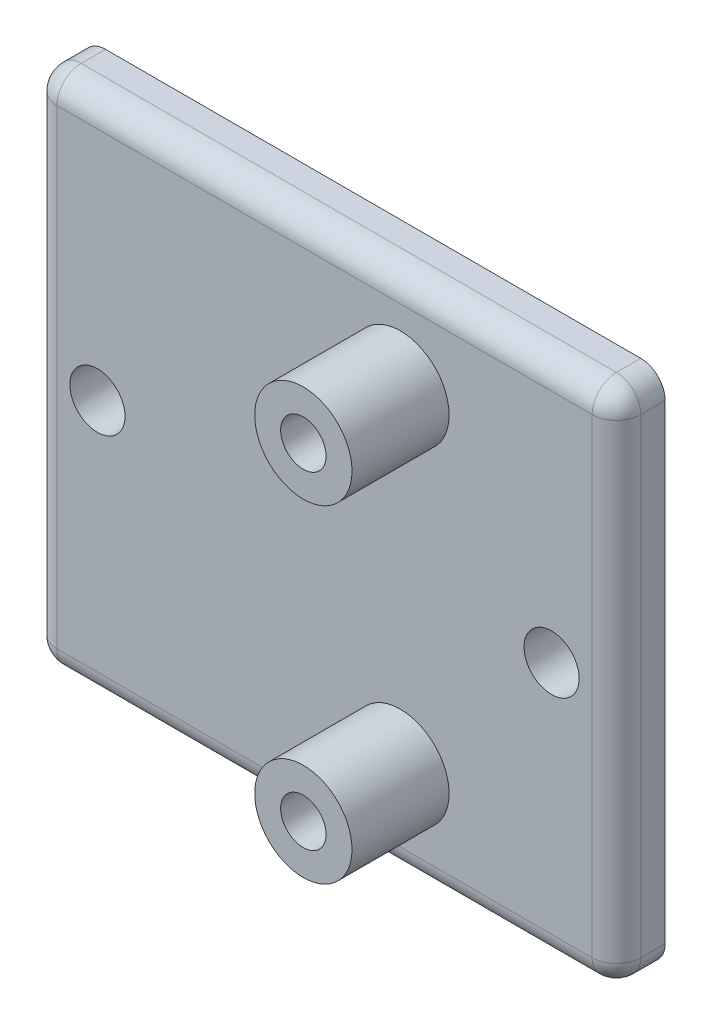
ISO-10303-21;
HEADER;
FILE_DESCRIPTION(('STEP AP214'),'2;1');
FILE_NAME('part.step','',(''),(''),'','','');
FILE_SCHEMA(('AUTOMOTIVE_DESIGN { 1 0 10303 214 1 1 1 1 }'));
ENDSEC;
DATA;
#1=APPLICATION_CONTEXT('core data for automotive mechanical design processes');
#2=APPLICATION_PROTOCOL_DEFINITION('international standard','automotive_design',2000,#1);
#3=PRODUCT_CONTEXT('',#1,'mechanical');
#4=PRODUCT('Part','Part','',(#3));
#5=PRODUCT_RELATED_PRODUCT_CATEGORY('part','',(#4));
#6=PRODUCT_DEFINITION_FORMATION('','',#4);
#7=PRODUCT_DEFINITION_CONTEXT('part definition',#1,'design');
#8=PRODUCT_DEFINITION('design','',#6,#7);
#9=PRODUCT_DEFINITION_SHAPE('','',#8);
#10=(LENGTH_UNIT() NAMED_UNIT(*) SI_UNIT(.MILLI.,.METRE.));
#11=(NAMED_UNIT(*) PLANE_ANGLE_UNIT() SI_UNIT($,.RADIAN.));
#12=(NAMED_UNIT(*) SI_UNIT($,.STERADIAN.) SOLID_ANGLE_UNIT());
#13=UNCERTAINTY_MEASURE_WITH_UNIT(LENGTH_MEASURE(1.E-05),#10,'distance_accuracy_value','');
#14=(GEOMETRIC_REPRESENTATION_CONTEXT(3) GLOBAL_UNCERTAINTY_ASSIGNED_CONTEXT((#13)) GLOBAL_UNIT_ASSIGNED_CONTEXT((#10,
#11,#12)) REPRESENTATION_CONTEXT('',''));
#15=CARTESIAN_POINT('',(0.,0.,0.));
#16=DIRECTION('',(0.,0.,1.));
#17=DIRECTION('',(1.,0.,0.));
#18=AXIS2_PLACEMENT_3D('',#15,#16,#17);
#19=CARTESIAN_POINT('',(36.68,-29.94,181.75));
#20=DIRECTION('',(0.,0.,1.));
#21=DIRECTION('',(1.,0.,0.));
#22=AXIS2_PLACEMENT_3D('',#19,#20,#21);
#23=PLANE('',#22);
#24=CARTESIAN_POINT('',(36.68,-29.94,181.75));
#25=DIRECTION('',(0.,0.,1.));
#26=DIRECTION('',(1.,0.,0.));
#27=AXIS2_PLACEMENT_3D('',#24,#25,#26);
#28=CIRCLE('',#27,1.4);
#29=CARTESIAN_POINT('',(38.08,-29.94,181.75));
#30=VERTEX_POINT('',#29);
#31=EDGE_CURVE('E9',#30,#30,#28,.T.);
#32=ORIENTED_EDGE('',*,*,#31,.T.);
#33=EDGE_LOOP('',(#32));
#34=FACE_BOUND('',#33,.T.);
#35=ADVANCED_FACE('F14',(#34),#23,.T.);
#36=CARTESIAN_POINT('',(36.68,-50.14,181.75));
#37=DIRECTION('',(0.,0.,1.));
#38=DIRECTION('',(1.,0.,0.));
#39=AXIS2_PLACEMENT_3D('',#36,#37,#38);
#40=PLANE('',#39);
#41=CARTESIAN_POINT('',(36.68,-50.14,181.75));
#42=DIRECTION('',(0.,0.,1.));
#43=DIRECTION('',(1.,0.,0.));
#44=AXIS2_PLACEMENT_3D('',#41,#42,#43);
#45=CIRCLE('',#44,1.4);
#46=CARTESIAN_POINT('',(38.08,-50.14,181.75));
#47=VERTEX_POINT('',#46);
#48=EDGE_CURVE('E213',#47,#47,#45,.T.);
#49=ORIENTED_EDGE('',*,*,#48,.T.);
#50=EDGE_LOOP('',(#49));
#51=FACE_BOUND('',#50,.T.);
#52=ADVANCED_FACE('F444',(#51),#40,.T.);
#53=CARTESIAN_POINT('',(36.68,-29.94,181.75));
#54=DIRECTION('',(0.,0.,1.));
#55=DIRECTION('',(1.,0.,0.));
#56=AXIS2_PLACEMENT_3D('',#53,#54,#55);
#57=CYLINDRICAL_SURFACE('',#56,1.4);
#58=DIRECTION('',(0.,0.,1.));
#59=VECTOR('',#58,1.);
#60=CARTESIAN_POINT('',(38.08,-29.94,181.75));
#61=LINE('',#60,#59);
#62=CARTESIAN_POINT('',(38.08,-29.94,190.485));
#63=VERTEX_POINT('',#62);
#64=EDGE_CURVE('E18',#30,#63,#61,.T.);
#65=ORIENTED_EDGE('',*,*,#64,.F.);
#66=ORIENTED_EDGE('',*,*,#31,.F.);
#67=ORIENTED_EDGE('',*,*,#64,.T.);
#68=CARTESIAN_POINT('',(36.68,-29.94,190.485));
#69=DIRECTION('',(0.,0.,1.));
#70=DIRECTION('',(1.,0.,0.));
#71=AXIS2_PLACEMENT_3D('',#68,#69,#70);
#72=CIRCLE('',#71,1.4);
#73=EDGE_CURVE('E303',#63,#63,#72,.T.);
#74=ORIENTED_EDGE('',*,*,#73,.T.);
#75=EDGE_LOOP('',(#65,#66,#67,#74));
#76=FACE_BOUND('',#75,.T.);
#77=ADVANCED_FACE('F449',(#76),#57,.F.);
#78=CARTESIAN_POINT('',(36.68,-50.14,181.75));
#79=DIRECTION('',(0.,0.,1.));
#80=DIRECTION('',(1.,0.,0.));
#81=AXIS2_PLACEMENT_3D('',#78,#79,#80);
#82=CYLINDRICAL_SURFACE('',#81,1.4);
#83=DIRECTION('',(0.,0.,1.));
#84=VECTOR('',#83,1.);
#85=CARTESIAN_POINT('',(38.08,-50.14,181.75));
#86=LINE('',#85,#84);
#87=CARTESIAN_POINT('',(38.08,-50.14,190.485));
#88=VERTEX_POINT('',#87);
#89=EDGE_CURVE('E216',#47,#88,#86,.T.);
#90=ORIENTED_EDGE('',*,*,#89,.F.);
#91=ORIENTED_EDGE('',*,*,#48,.F.);
#92=ORIENTED_EDGE('',*,*,#89,.T.);
#93=CARTESIAN_POINT('',(36.68,-50.14,190.485));
#94=DIRECTION('',(0.,0.,1.));
#95=DIRECTION('',(1.,0.,0.));
#96=AXIS2_PLACEMENT_3D('',#93,#94,#95);
#97=CIRCLE('',#96,1.4);
#98=EDGE_CURVE('E296',#88,#88,#97,.T.);
#99=ORIENTED_EDGE('',*,*,#98,.T.);
#100=EDGE_LOOP('',(#90,#91,#92,#99));
#101=FACE_BOUND('',#100,.T.);
#102=ADVANCED_FACE('F454',(#101),#82,.F.);
#103=CARTESIAN_POINT('',(36.68,-29.94,190.485));
#104=DIRECTION('',(0.,0.,1.));
#105=DIRECTION('',(1.,0.,0.));
#106=AXIS2_PLACEMENT_3D('',#103,#104,#105);
#107=PLANE('',#106);
#108=ORIENTED_EDGE('',*,*,#73,.F.);
#109=EDGE_LOOP('',(#108));
#110=FACE_BOUND('',#109,.T.);
#111=CARTESIAN_POINT('',(36.68,-29.94,190.485));
#112=DIRECTION('',(0.,0.,1.));
#113=DIRECTION('',(1.,0.,0.));
#114=AXIS2_PLACEMENT_3D('',#111,#112,#113);
#115=CIRCLE('',#114,3.);
#116=CARTESIAN_POINT('',(39.68,-29.94,190.485));
#117=VERTEX_POINT('',#116);
#118=EDGE_CURVE('E268',#117,#117,#115,.T.);
#119=ORIENTED_EDGE('',*,*,#118,.T.);
#120=EDGE_LOOP('',(#119));
#121=FACE_BOUND('',#120,.T.);
#122=ADVANCED_FACE('F456',(#110,#121),#107,.T.);
#123=CARTESIAN_POINT('',(36.68,-50.14,190.485));
#124=DIRECTION('',(0.,0.,1.));
#125=DIRECTION('',(1.,0.,0.));
#126=AXIS2_PLACEMENT_3D('',#123,#124,#125);
#127=PLANE('',#126);
#128=ORIENTED_EDGE('',*,*,#98,.F.);
#129=EDGE_LOOP('',(#128));
#130=FACE_BOUND('',#129,.T.);
#131=CARTESIAN_POINT('',(36.68,-50.14,190.485));
#132=DIRECTION('',(0.,0.,1.));
#133=DIRECTION('',(1.,0.,0.));
#134=AXIS2_PLACEMENT_3D('',#131,#132,#133);
#135=CIRCLE('',#134,3.);
#136=CARTESIAN_POINT('',(39.68,-50.14,190.485));
#137=VERTEX_POINT('',#136);
#138=EDGE_CURVE('E269',#137,#137,#135,.T.);
#139=ORIENTED_EDGE('',*,*,#138,.T.);
#140=EDGE_LOOP('',(#139));
#141=FACE_BOUND('',#140,.T.);
#142=ADVANCED_FACE('F470',(#130,#141),#127,.T.);
#143=CARTESIAN_POINT('',(36.68,-29.94,184.495));
#144=DIRECTION('',(0.,0.,1.));
#145=DIRECTION('',(1.,0.,0.));
#146=AXIS2_PLACEMENT_3D('',#143,#144,#145);
#147=CYLINDRICAL_SURFACE('',#146,3.);
#148=DIRECTION('',(0.,0.,1.));
#149=VECTOR('',#148,1.);
#150=CARTESIAN_POINT('',(39.68,-29.94,184.495));
#151=LINE('',#150,#149);
#152=CARTESIAN_POINT('',(39.68,-29.94,184.5));
#153=VERTEX_POINT('',#152);
#154=EDGE_CURVE('E264',#153,#117,#151,.T.);
#155=ORIENTED_EDGE('',*,*,#154,.T.);
#156=ORIENTED_EDGE('',*,*,#118,.F.);
#157=ORIENTED_EDGE('',*,*,#154,.F.);
#158=CARTESIAN_POINT('',(36.68,-29.94,184.5));
#159=DIRECTION('',(0.,0.,1.));
#160=DIRECTION('',(1.,0.,0.));
#161=AXIS2_PLACEMENT_3D('',#158,#159,#160);
#162=CIRCLE('',#161,3.);
#163=EDGE_CURVE('E278',#153,#153,#162,.T.);
#164=ORIENTED_EDGE('',*,*,#163,.T.);
#165=EDGE_LOOP('',(#155,#156,#157,#164));
#166=FACE_BOUND('',#165,.T.);
#167=ADVANCED_FACE('F467',(#166),#147,.T.);
#168=CARTESIAN_POINT('',(36.68,-50.14,184.495));
#169=DIRECTION('',(0.,0.,1.));
#170=DIRECTION('',(1.,0.,0.));
#171=AXIS2_PLACEMENT_3D('',#168,#169,#170);
#172=CYLINDRICAL_SURFACE('',#171,3.);
#173=DIRECTION('',(0.,0.,1.));
#174=VECTOR('',#173,1.);
#175=CARTESIAN_POINT('',(39.68,-50.14,184.495));
#176=LINE('',#175,#174);
#177=CARTESIAN_POINT('',(39.68,-50.14,184.5));
#178=VERTEX_POINT('',#177);
#179=EDGE_CURVE('E182',#178,#137,#176,.T.);
#180=ORIENTED_EDGE('',*,*,#179,.T.);
#181=ORIENTED_EDGE('',*,*,#138,.F.);
#182=ORIENTED_EDGE('',*,*,#179,.F.);
#183=CARTESIAN_POINT('',(36.68,-50.14,184.5));
#184=DIRECTION('',(0.,0.,1.));
#185=DIRECTION('',(1.,0.,0.));
#186=AXIS2_PLACEMENT_3D('',#183,#184,#185);
#187=CIRCLE('',#186,3.);
#188=EDGE_CURVE('E228',#178,#178,#187,.T.);
#189=ORIENTED_EDGE('',*,*,#188,.T.);
#190=EDGE_LOOP('',(#180,#181,#182,#189));
#191=FACE_BOUND('',#190,.T.);
#192=ADVANCED_FACE('F347',(#191),#172,.T.);
#193=CARTESIAN_POINT('',(48.5,-56.,183.));
#194=DIRECTION('',(0.,1.,0.));
#195=DIRECTION('',(1.,0.,0.));
#196=AXIS2_PLACEMENT_3D('',#193,#194,#195);
#197=CYLINDRICAL_SURFACE('',#196,1.5);
#198=DIRECTION('',(0.,1.,0.));
#199=VECTOR('',#198,1.);
#200=CARTESIAN_POINT('',(50.,-56.,183.));
#201=LINE('',#200,#199);
#202=CARTESIAN_POINT('',(50.,-54.5,183.));
#203=VERTEX_POINT('',#202);
#204=CARTESIAN_POINT('',(50.,-25.5,183.));
#205=VERTEX_POINT('',#204);
#206=EDGE_CURVE('E194',#203,#205,#201,.T.);
#207=ORIENTED_EDGE('',*,*,#206,.T.);
#208=CARTESIAN_POINT('',(48.5,-25.5,183.));
#209=DIRECTION('',(0.,-1.,0.));
#210=DIRECTION('',(1.,0.,0.));
#211=AXIS2_PLACEMENT_3D('',#208,#209,#210);
#212=CIRCLE('',#211,1.5);
#213=CARTESIAN_POINT('',(48.5,-25.5,184.5));
#214=VERTEX_POINT('',#213);
#215=EDGE_CURVE('E181',#205,#214,#212,.T.);
#216=ORIENTED_EDGE('',*,*,#215,.T.);
#217=DIRECTION('',(0.,1.,0.));
#218=VECTOR('',#217,1.);
#219=CARTESIAN_POINT('',(48.5,-56.,184.5));
#220=LINE('',#219,#218);
#221=CARTESIAN_POINT('',(48.5,-54.5,184.5));
#222=VERTEX_POINT('',#221);
#223=EDGE_CURVE('E179',#222,#214,#220,.T.);
#224=ORIENTED_EDGE('',*,*,#223,.F.);
#225=CARTESIAN_POINT('',(48.5,-54.5,183.));
#226=DIRECTION('',(0.,1.,0.));
#227=DIRECTION('',(1.,0.,0.));
#228=AXIS2_PLACEMENT_3D('',#225,#226,#227);
#229=CIRCLE('',#228,1.5);
#230=EDGE_CURVE('E183',#222,#203,#229,.T.);
#231=ORIENTED_EDGE('',*,*,#230,.T.);
#232=EDGE_LOOP('',(#207,#216,#224,#231));
#233=FACE_BOUND('',#232,.T.);
#234=ADVANCED_FACE('F428',(#233),#197,.T.);
#235=CARTESIAN_POINT('',(48.5,-25.5,183.));
#236=DIRECTION('',(0.,-1.,0.));
#237=DIRECTION('',(1.,0.,0.));
#238=AXIS2_PLACEMENT_3D('',#235,#236,#237);
#239=SPHERICAL_SURFACE('',#238,1.5);
#240=CARTESIAN_POINT('',(48.5,-25.5,183.));
#241=DIRECTION('',(0.,0.,-1.));
#242=DIRECTION('',(1.,0.,0.));
#243=AXIS2_PLACEMENT_3D('',#240,#241,#242);
#244=CIRCLE('',#243,1.5);
#245=CARTESIAN_POINT('',(48.5,-24.,183.));
#246=VERTEX_POINT('',#245);
#247=EDGE_CURVE('E195',#246,#205,#244,.T.);
#248=ORIENTED_EDGE('',*,*,#247,.F.);
#249=CARTESIAN_POINT('',(48.5,-25.5,183.));
#250=DIRECTION('',(1.,0.,0.));
#251=DIRECTION('',(0.,0.,1.));
#252=AXIS2_PLACEMENT_3D('',#249,#250,#251);
#253=CIRCLE('',#252,1.5);
#254=EDGE_CURVE('E222',#246,#214,#253,.T.);
#255=ORIENTED_EDGE('',*,*,#254,.T.);
#256=ORIENTED_EDGE('',*,*,#215,.F.);
#257=EDGE_LOOP('',(#248,#255,#256));
#258=FACE_BOUND('',#257,.T.);
#259=ADVANCED_FACE('F425',(#258),#239,.T.);
#260=CARTESIAN_POINT('',(48.5,-54.5,183.));
#261=DIRECTION('',(0.,0.,-1.));
#262=DIRECTION('',(1.,0.,0.));
#263=AXIS2_PLACEMENT_3D('',#260,#261,#262);
#264=SPHERICAL_SURFACE('',#263,1.5);
#265=ORIENTED_EDGE('',*,*,#230,.F.);
#266=CARTESIAN_POINT('',(48.5,-54.5,183.));
#267=DIRECTION('',(1.,0.,0.));
#268=DIRECTION('',(0.,-1.,0.));
#269=AXIS2_PLACEMENT_3D('',#266,#267,#268);
#270=CIRCLE('',#269,1.5);
#271=CARTESIAN_POINT('',(48.5,-56.,183.));
#272=VERTEX_POINT('',#271);
#273=EDGE_CURVE('E134',#222,#272,#270,.T.);
#274=ORIENTED_EDGE('',*,*,#273,.T.);
#275=CARTESIAN_POINT('',(48.5,-54.5,183.));
#276=DIRECTION('',(0.,0.,-1.));
#277=DIRECTION('',(1.,0.,0.));
#278=AXIS2_PLACEMENT_3D('',#275,#276,#277);
#279=CIRCLE('',#278,1.5);
#280=EDGE_CURVE('E251',#203,#272,#279,.T.);
#281=ORIENTED_EDGE('',*,*,#280,.F.);
#282=EDGE_LOOP('',(#265,#274,#281));
#283=FACE_BOUND('',#282,.T.);
#284=ADVANCED_FACE('F429',(#283),#264,.T.);
#285=CARTESIAN_POINT('',(14.,-25.5,183.));
#286=DIRECTION('',(1.,0.,0.));
#287=DIRECTION('',(0.,1.,0.));
#288=AXIS2_PLACEMENT_3D('',#285,#286,#287);
#289=CYLINDRICAL_SURFACE('',#288,1.5);
#290=CARTESIAN_POINT('',(15.5,-25.5,183.));
#291=DIRECTION('',(1.,0.,0.));
#292=DIRECTION('',(0.,0.,1.));
#293=AXIS2_PLACEMENT_3D('',#290,#291,#292);
#294=CIRCLE('',#293,1.5);
#295=CARTESIAN_POINT('',(15.5,-24.,183.));
#296=VERTEX_POINT('',#295);
#297=CARTESIAN_POINT('',(15.5,-25.5,184.5));
#298=VERTEX_POINT('',#297);
#299=EDGE_CURVE('E172',#296,#298,#294,.T.);
#300=ORIENTED_EDGE('',*,*,#299,.T.);
#301=DIRECTION('',(1.,0.,0.));
#302=VECTOR('',#301,1.);
#303=CARTESIAN_POINT('',(14.,-25.5,184.5));
#304=LINE('',#303,#302);
#305=EDGE_CURVE('E146',#298,#214,#304,.T.);
#306=ORIENTED_EDGE('',*,*,#305,.T.);
#307=ORIENTED_EDGE('',*,*,#254,.F.);
#308=DIRECTION('',(1.,0.,0.));
#309=VECTOR('',#308,1.);
#310=CARTESIAN_POINT('',(14.,-24.,183.));
#311=LINE('',#310,#309);
#312=EDGE_CURVE('E189',#296,#246,#311,.T.);
#313=ORIENTED_EDGE('',*,*,#312,.F.);
#314=EDGE_LOOP('',(#300,#306,#307,#313));
#315=FACE_BOUND('',#314,.T.);
#316=ADVANCED_FACE('F423',(#315),#289,.T.);
#317=CARTESIAN_POINT('',(14.,-54.5,183.));
#318=DIRECTION('',(1.,0.,0.));
#319=DIRECTION('',(0.,-1.,0.));
#320=AXIS2_PLACEMENT_3D('',#317,#318,#319);
#321=CYLINDRICAL_SURFACE('',#320,1.5);
#322=DIRECTION('',(1.,0.,0.));
#323=VECTOR('',#322,1.);
#324=CARTESIAN_POINT('',(14.,-56.,183.));
#325=LINE('',#324,#323);
#326=CARTESIAN_POINT('',(15.5,-56.,183.));
#327=VERTEX_POINT('',#326);
#328=EDGE_CURVE('E185',#327,#272,#325,.T.);
#329=ORIENTED_EDGE('',*,*,#328,.T.);
#330=ORIENTED_EDGE('',*,*,#273,.F.);
#331=DIRECTION('',(1.,0.,0.));
#332=VECTOR('',#331,1.);
#333=CARTESIAN_POINT('',(14.,-54.5,184.5));
#334=LINE('',#333,#332);
#335=CARTESIAN_POINT('',(15.5,-54.5,184.5));
#336=VERTEX_POINT('',#335);
#337=EDGE_CURVE('E255',#336,#222,#334,.T.);
#338=ORIENTED_EDGE('',*,*,#337,.F.);
#339=CARTESIAN_POINT('',(15.5,-54.5,183.));
#340=DIRECTION('',(1.,0.,0.));
#341=DIRECTION('',(0.,-1.,0.));
#342=AXIS2_PLACEMENT_3D('',#339,#340,#341);
#343=CIRCLE('',#342,1.5);
#344=EDGE_CURVE('E166',#336,#327,#343,.T.);
#345=ORIENTED_EDGE('',*,*,#344,.T.);
#346=EDGE_LOOP('',(#329,#330,#338,#345));
#347=FACE_BOUND('',#346,.T.);
#348=ADVANCED_FACE('F353',(#347),#321,.T.);
#349=CARTESIAN_POINT('',(14.,-56.,184.5));
#350=DIRECTION('',(0.,0.,1.));
#351=DIRECTION('',(1.,0.,0.));
#352=AXIS2_PLACEMENT_3D('',#349,#350,#351);
#353=PLANE('',#352);
#354=ORIENTED_EDGE('',*,*,#163,.F.);
#355=EDGE_LOOP('',(#354));
#356=FACE_BOUND('',#355,.T.);
#357=CARTESIAN_POINT('',(46.,-40.,184.5));
#358=DIRECTION('',(0.,0.,1.));
#359=DIRECTION('',(1.,0.,0.));
#360=AXIS2_PLACEMENT_3D('',#357,#358,#359);
#361=CIRCLE('',#360,1.7);
#362=CARTESIAN_POINT('',(47.7,-40.,184.5));
#363=VERTEX_POINT('',#362);
#364=EDGE_CURVE('E159',#363,#363,#361,.T.);
#365=ORIENTED_EDGE('',*,*,#364,.F.);
#366=EDGE_LOOP('',(#365));
#367=FACE_BOUND('',#366,.T.);
#368=CARTESIAN_POINT('',(18.,-40.,184.5));
#369=DIRECTION('',(0.,0.,1.));
#370=DIRECTION('',(1.,0.,0.));
#371=AXIS2_PLACEMENT_3D('',#368,#369,#370);
#372=CIRCLE('',#371,1.7);
#373=CARTESIAN_POINT('',(19.7,-40.,184.5));
#374=VERTEX_POINT('',#373);
#375=EDGE_CURVE('E175',#374,#374,#372,.T.);
#376=ORIENTED_EDGE('',*,*,#375,.F.);
#377=EDGE_LOOP('',(#376));
#378=FACE_BOUND('',#377,.T.);
#379=ORIENTED_EDGE('',*,*,#188,.F.);
#380=EDGE_LOOP('',(#379));
#381=FACE_BOUND('',#380,.T.);
#382=DIRECTION('',(0.,1.,0.));
#383=VECTOR('',#382,1.);
#384=CARTESIAN_POINT('',(15.5,-56.,184.5));
#385=LINE('',#384,#383);
#386=EDGE_CURVE('E229',#336,#298,#385,.T.);
#387=ORIENTED_EDGE('',*,*,#386,.F.);
#388=ORIENTED_EDGE('',*,*,#337,.T.);
#389=ORIENTED_EDGE('',*,*,#223,.T.);
#390=ORIENTED_EDGE('',*,*,#305,.F.);
#391=EDGE_LOOP('',(#387,#388,#389,#390));
#392=FACE_BOUND('',#391,.T.);
#393=ADVANCED_FACE('F350',(#356,#367,#378,#381,#392),#353,.T.);
#394=CARTESIAN_POINT('',(15.5,-25.5,183.));
#395=DIRECTION('',(0.,-1.,0.));
#396=DIRECTION('',(-1.,0.,0.));
#397=AXIS2_PLACEMENT_3D('',#394,#395,#396);
#398=SPHERICAL_SURFACE('',#397,1.5);
#399=CARTESIAN_POINT('',(15.5,-25.5,183.));
#400=DIRECTION('',(0.,1.,0.));
#401=DIRECTION('',(-1.,0.,0.));
#402=AXIS2_PLACEMENT_3D('',#399,#400,#401);
#403=CIRCLE('',#402,1.5);
#404=CARTESIAN_POINT('',(14.,-25.5,183.));
#405=VERTEX_POINT('',#404);
#406=EDGE_CURVE('E212',#405,#298,#403,.T.);
#407=ORIENTED_EDGE('',*,*,#406,.T.);
#408=ORIENTED_EDGE('',*,*,#299,.F.);
#409=CARTESIAN_POINT('',(15.5,-25.5,183.));
#410=DIRECTION('',(0.,0.,1.));
#411=DIRECTION('',(-1.,0.,0.));
#412=AXIS2_PLACEMENT_3D('',#409,#410,#411);
#413=CIRCLE('',#412,1.5);
#414=EDGE_CURVE('E238',#296,#405,#413,.T.);
#415=ORIENTED_EDGE('',*,*,#414,.T.);
#416=EDGE_LOOP('',(#407,#408,#415));
#417=FACE_BOUND('',#416,.T.);
#418=ADVANCED_FACE('F352',(#417),#398,.T.);
#419=CARTESIAN_POINT('',(15.5,-54.5,183.));
#420=DIRECTION('',(0.,0.,-1.));
#421=DIRECTION('',(-1.,0.,0.));
#422=AXIS2_PLACEMENT_3D('',#419,#420,#421);
#423=SPHERICAL_SURFACE('',#422,1.5);
#424=CARTESIAN_POINT('',(15.5,-54.5,183.));
#425=DIRECTION('',(0.,0.,1.));
#426=DIRECTION('',(-1.,0.,0.));
#427=AXIS2_PLACEMENT_3D('',#424,#425,#426);
#428=CIRCLE('',#427,1.5);
#429=CARTESIAN_POINT('',(14.,-54.5,183.));
#430=VERTEX_POINT('',#429);
#431=EDGE_CURVE('E289',#430,#327,#428,.T.);
#432=ORIENTED_EDGE('',*,*,#431,.T.);
#433=ORIENTED_EDGE('',*,*,#344,.F.);
#434=CARTESIAN_POINT('',(15.5,-54.5,183.));
#435=DIRECTION('',(0.,-1.,0.));
#436=DIRECTION('',(-1.,0.,0.));
#437=AXIS2_PLACEMENT_3D('',#434,#435,#436);
#438=CIRCLE('',#437,1.5);
#439=EDGE_CURVE('E233',#336,#430,#438,.T.);
#440=ORIENTED_EDGE('',*,*,#439,.T.);
#441=EDGE_LOOP('',(#432,#433,#440));
#442=FACE_BOUND('',#441,.T.);
#443=ADVANCED_FACE('F365',(#442),#423,.T.);
#444=CARTESIAN_POINT('',(46.,-40.,181.4));
#445=DIRECTION('',(0.,0.,1.));
#446=DIRECTION('',(1.,0.,0.));
#447=AXIS2_PLACEMENT_3D('',#444,#445,#446);
#448=CYLINDRICAL_SURFACE('',#447,1.7);
#449=DIRECTION('',(0.,0.,1.));
#450=VECTOR('',#449,1.);
#451=CARTESIAN_POINT('',(47.7,-40.,181.4));
#452=LINE('',#451,#450);
#453=CARTESIAN_POINT('',(47.7,-40.,181.5));
#454=VERTEX_POINT('',#453);
#455=EDGE_CURVE('E162',#454,#363,#452,.T.);
#456=ORIENTED_EDGE('',*,*,#455,.F.);
#457=CARTESIAN_POINT('',(46.,-40.,181.5));
#458=DIRECTION('',(0.,0.,1.));
#459=DIRECTION('',(1.,0.,0.));
#460=AXIS2_PLACEMENT_3D('',#457,#458,#459);
#461=CIRCLE('',#460,1.7);
#462=EDGE_CURVE('E319',#454,#454,#461,.T.);
#463=ORIENTED_EDGE('',*,*,#462,.F.);
#464=ORIENTED_EDGE('',*,*,#455,.T.);
#465=ORIENTED_EDGE('',*,*,#364,.T.);
#466=EDGE_LOOP('',(#456,#463,#464,#465));
#467=FACE_BOUND('',#466,.T.);
#468=ADVANCED_FACE('F160',(#467),#448,.F.);
#469=CARTESIAN_POINT('',(18.,-40.,181.4));
#470=DIRECTION('',(0.,0.,1.));
#471=DIRECTION('',(1.,0.,0.));
#472=AXIS2_PLACEMENT_3D('',#469,#470,#471);
#473=CYLINDRICAL_SURFACE('',#472,1.7);
#474=DIRECTION('',(0.,0.,1.));
#475=VECTOR('',#474,1.);
#476=CARTESIAN_POINT('',(19.7,-40.,181.4));
#477=LINE('',#476,#475);
#478=CARTESIAN_POINT('',(19.7,-40.,181.5));
#479=VERTEX_POINT('',#478);
#480=EDGE_CURVE('E254',#479,#374,#477,.T.);
#481=ORIENTED_EDGE('',*,*,#480,.F.);
#482=CARTESIAN_POINT('',(18.,-40.,181.5));
#483=DIRECTION('',(0.,0.,1.));
#484=DIRECTION('',(1.,0.,0.));
#485=AXIS2_PLACEMENT_3D('',#482,#483,#484);
#486=CIRCLE('',#485,1.7);
#487=EDGE_CURVE('E242',#479,#479,#486,.T.);
#488=ORIENTED_EDGE('',*,*,#487,.F.);
#489=ORIENTED_EDGE('',*,*,#480,.T.);
#490=ORIENTED_EDGE('',*,*,#375,.T.);
#491=EDGE_LOOP('',(#481,#488,#489,#490));
#492=FACE_BOUND('',#491,.T.);
#493=ADVANCED_FACE('F16',(#492),#473,.F.);
#494=CARTESIAN_POINT('',(50.,-56.,181.5));
#495=DIRECTION('',(1.,0.,0.));
#496=DIRECTION('',(0.,1.,0.));
#497=AXIS2_PLACEMENT_3D('',#494,#495,#496);
#498=PLANE('',#497);
#499=DIRECTION('',(0.,1.,0.));
#500=VECTOR('',#499,1.);
#501=CARTESIAN_POINT('',(50.,-56.,181.5));
#502=LINE('',#501,#500);
#503=CARTESIAN_POINT('',(50.,-54.5,181.5));
#504=VERTEX_POINT('',#503);
#505=CARTESIAN_POINT('',(50.,-25.5,181.5));
#506=VERTEX_POINT('',#505);
#507=EDGE_CURVE('E203',#504,#506,#502,.T.);
#508=ORIENTED_EDGE('',*,*,#507,.T.);
#509=DIRECTION('',(0.,0.,1.));
#510=VECTOR('',#509,1.);
#511=CARTESIAN_POINT('',(50.,-25.5,181.5));
#512=LINE('',#511,#510);
#513=EDGE_CURVE('E191',#506,#205,#512,.T.);
#514=ORIENTED_EDGE('',*,*,#513,.T.);
#515=ORIENTED_EDGE('',*,*,#206,.F.);
#516=DIRECTION('',(0.,0.,1.));
#517=VECTOR('',#516,1.);
#518=CARTESIAN_POINT('',(50.,-54.5,181.5));
#519=LINE('',#518,#517);
#520=EDGE_CURVE('E247',#504,#203,#519,.T.);
#521=ORIENTED_EDGE('',*,*,#520,.F.);
#522=EDGE_LOOP('',(#508,#514,#515,#521));
#523=FACE_BOUND('',#522,.T.);
#524=ADVANCED_FACE('F401',(#523),#498,.T.);
#525=CARTESIAN_POINT('',(48.5,-25.5,181.5));
#526=DIRECTION('',(0.,0.,1.));
#527=DIRECTION('',(1.,0.,0.));
#528=AXIS2_PLACEMENT_3D('',#525,#526,#527);
#529=CYLINDRICAL_SURFACE('',#528,1.5);
#530=CARTESIAN_POINT('',(48.5,-25.5,181.5));
#531=DIRECTION('',(0.,0.,1.));
#532=DIRECTION('',(0.,-1.,0.));
#533=AXIS2_PLACEMENT_3D('',#530,#531,#532);
#534=CIRCLE('',#533,1.5);
#535=CARTESIAN_POINT('',(48.5,-24.,181.5));
#536=VERTEX_POINT('',#535);
#537=EDGE_CURVE('E208',#506,#536,#534,.T.);
#538=ORIENTED_EDGE('',*,*,#537,.T.);
#539=DIRECTION('',(0.,0.,1.));
#540=VECTOR('',#539,1.);
#541=CARTESIAN_POINT('',(48.5,-24.,181.5));
#542=LINE('',#541,#540);
#543=EDGE_CURVE('E243',#536,#246,#542,.T.);
#544=ORIENTED_EDGE('',*,*,#543,.T.);
#545=ORIENTED_EDGE('',*,*,#247,.T.);
#546=ORIENTED_EDGE('',*,*,#513,.F.);
#547=EDGE_LOOP('',(#538,#544,#545,#546));
#548=FACE_BOUND('',#547,.T.);
#549=ADVANCED_FACE('F397',(#548),#529,.T.);
#550=CARTESIAN_POINT('',(48.5,-54.5,181.5));
#551=DIRECTION('',(0.,0.,1.));
#552=DIRECTION('',(1.,0.,0.));
#553=AXIS2_PLACEMENT_3D('',#550,#551,#552);
#554=CYLINDRICAL_SURFACE('',#553,1.5);
#555=ORIENTED_EDGE('',*,*,#520,.T.);
#556=ORIENTED_EDGE('',*,*,#280,.T.);
#557=DIRECTION('',(0.,0.,1.));
#558=VECTOR('',#557,1.);
#559=CARTESIAN_POINT('',(48.5,-56.,181.5));
#560=LINE('',#559,#558);
#561=CARTESIAN_POINT('',(48.5,-56.,181.5));
#562=VERTEX_POINT('',#561);
#563=EDGE_CURVE('E190',#562,#272,#560,.T.);
#564=ORIENTED_EDGE('',*,*,#563,.F.);
#565=CARTESIAN_POINT('',(48.5,-54.5,181.5));
#566=DIRECTION('',(0.,0.,-1.));
#567=DIRECTION('',(0.,-1.,0.));
#568=AXIS2_PLACEMENT_3D('',#565,#566,#567);
#569=CIRCLE('',#568,1.5);
#570=EDGE_CURVE('E207',#504,#562,#569,.T.);
#571=ORIENTED_EDGE('',*,*,#570,.F.);
#572=EDGE_LOOP('',(#555,#556,#564,#571));
#573=FACE_BOUND('',#572,.T.);
#574=ADVANCED_FACE('F406',(#573),#554,.T.);
#575=CARTESIAN_POINT('',(14.,-24.,181.5));
#576=DIRECTION('',(0.,1.,0.));
#577=DIRECTION('',(1.,0.,0.));
#578=AXIS2_PLACEMENT_3D('',#575,#576,#577);
#579=PLANE('',#578);
#580=DIRECTION('',(1.,0.,0.));
#581=VECTOR('',#580,1.);
#582=CARTESIAN_POINT('',(14.,-24.,181.5));
#583=LINE('',#582,#581);
#584=CARTESIAN_POINT('',(15.5,-24.,181.5));
#585=VERTEX_POINT('',#584);
#586=EDGE_CURVE('E294',#585,#536,#583,.T.);
#587=ORIENTED_EDGE('',*,*,#586,.F.);
#588=DIRECTION('',(0.,0.,1.));
#589=VECTOR('',#588,1.);
#590=CARTESIAN_POINT('',(15.5,-24.,181.5));
#591=LINE('',#590,#589);
#592=EDGE_CURVE('E234',#585,#296,#591,.T.);
#593=ORIENTED_EDGE('',*,*,#592,.T.);
#594=ORIENTED_EDGE('',*,*,#312,.T.);
#595=ORIENTED_EDGE('',*,*,#543,.F.);
#596=EDGE_LOOP('',(#587,#593,#594,#595));
#597=FACE_BOUND('',#596,.T.);
#598=ADVANCED_FACE('F392',(#597),#579,.T.);
#599=CARTESIAN_POINT('',(14.,-56.,181.5));
#600=DIRECTION('',(0.,1.,0.));
#601=DIRECTION('',(1.,0.,0.));
#602=AXIS2_PLACEMENT_3D('',#599,#600,#601);
#603=PLANE('',#602);
#604=ORIENTED_EDGE('',*,*,#563,.T.);
#605=ORIENTED_EDGE('',*,*,#328,.F.);
#606=DIRECTION('',(0.,0.,1.));
#607=VECTOR('',#606,1.);
#608=CARTESIAN_POINT('',(15.5,-56.,181.5));
#609=LINE('',#608,#607);
#610=CARTESIAN_POINT('',(15.5,-56.,181.5));
#611=VERTEX_POINT('',#610);
#612=EDGE_CURVE('E322',#611,#327,#609,.T.);
#613=ORIENTED_EDGE('',*,*,#612,.F.);
#614=DIRECTION('',(1.,0.,0.));
#615=VECTOR('',#614,1.);
#616=CARTESIAN_POINT('',(14.,-56.,181.5));
#617=LINE('',#616,#615);
#618=EDGE_CURVE('E217',#611,#562,#617,.T.);
#619=ORIENTED_EDGE('',*,*,#618,.T.);
#620=EDGE_LOOP('',(#604,#605,#613,#619));
#621=FACE_BOUND('',#620,.T.);
#622=ADVANCED_FACE('F409',(#621),#603,.F.);
#623=CARTESIAN_POINT('',(15.5,-56.,183.));
#624=DIRECTION('',(0.,1.,0.));
#625=DIRECTION('',(-1.,0.,0.));
#626=AXIS2_PLACEMENT_3D('',#623,#624,#625);
#627=CYLINDRICAL_SURFACE('',#626,1.5);
#628=ORIENTED_EDGE('',*,*,#439,.F.);
#629=ORIENTED_EDGE('',*,*,#386,.T.);
#630=ORIENTED_EDGE('',*,*,#406,.F.);
#631=DIRECTION('',(0.,1.,0.));
#632=VECTOR('',#631,1.);
#633=CARTESIAN_POINT('',(14.,-56.,183.));
#634=LINE('',#633,#632);
#635=EDGE_CURVE('E197',#430,#405,#634,.T.);
#636=ORIENTED_EDGE('',*,*,#635,.F.);
#637=EDGE_LOOP('',(#628,#629,#630,#636));
#638=FACE_BOUND('',#637,.T.);
#639=ADVANCED_FACE('F360',(#638),#627,.T.);
#640=CARTESIAN_POINT('',(15.5,-25.5,181.5));
#641=DIRECTION('',(0.,0.,1.));
#642=DIRECTION('',(-1.,0.,0.));
#643=AXIS2_PLACEMENT_3D('',#640,#641,#642);
#644=CYLINDRICAL_SURFACE('',#643,1.5);
#645=DIRECTION('',(0.,0.,1.));
#646=VECTOR('',#645,1.);
#647=CARTESIAN_POINT('',(14.,-25.5,181.5));
#648=LINE('',#647,#646);
#649=CARTESIAN_POINT('',(14.,-25.5,181.5));
#650=VERTEX_POINT('',#649);
#651=EDGE_CURVE('E201',#650,#405,#648,.T.);
#652=ORIENTED_EDGE('',*,*,#651,.T.);
#653=ORIENTED_EDGE('',*,*,#414,.F.);
#654=ORIENTED_EDGE('',*,*,#592,.F.);
#655=CARTESIAN_POINT('',(15.5,-25.5,181.5));
#656=DIRECTION('',(0.,0.,-1.));
#657=DIRECTION('',(0.,-1.,0.));
#658=AXIS2_PLACEMENT_3D('',#655,#656,#657);
#659=CIRCLE('',#658,1.5);
#660=EDGE_CURVE('E285',#650,#585,#659,.T.);
#661=ORIENTED_EDGE('',*,*,#660,.F.);
#662=EDGE_LOOP('',(#652,#653,#654,#661));
#663=FACE_BOUND('',#662,.T.);
#664=ADVANCED_FACE('F417',(#663),#644,.T.);
#665=CARTESIAN_POINT('',(15.5,-54.5,181.5));
#666=DIRECTION('',(0.,0.,1.));
#667=DIRECTION('',(-1.,0.,0.));
#668=AXIS2_PLACEMENT_3D('',#665,#666,#667);
#669=CYLINDRICAL_SURFACE('',#668,1.5);
#670=CARTESIAN_POINT('',(15.5,-54.5,181.5));
#671=DIRECTION('',(0.,0.,1.));
#672=DIRECTION('',(0.,-1.,0.));
#673=AXIS2_PLACEMENT_3D('',#670,#671,#672);
#674=CIRCLE('',#673,1.5);
#675=CARTESIAN_POINT('',(14.,-54.5,181.5));
#676=VERTEX_POINT('',#675);
#677=EDGE_CURVE('E221',#676,#611,#674,.T.);
#678=ORIENTED_EDGE('',*,*,#677,.T.);
#679=ORIENTED_EDGE('',*,*,#612,.T.);
#680=ORIENTED_EDGE('',*,*,#431,.F.);
#681=DIRECTION('',(0.,0.,1.));
#682=VECTOR('',#681,1.);
#683=CARTESIAN_POINT('',(14.,-54.5,181.5));
#684=LINE('',#683,#682);
#685=EDGE_CURVE('E202',#676,#430,#684,.T.);
#686=ORIENTED_EDGE('',*,*,#685,.F.);
#687=EDGE_LOOP('',(#678,#679,#680,#686));
#688=FACE_BOUND('',#687,.T.);
#689=ADVANCED_FACE('F369',(#688),#669,.T.);
#690=CARTESIAN_POINT('',(14.,-56.,181.5));
#691=DIRECTION('',(0.,0.,1.));
#692=DIRECTION('',(1.,0.,0.));
#693=AXIS2_PLACEMENT_3D('',#690,#691,#692);
#694=PLANE('',#693);
#695=ORIENTED_EDGE('',*,*,#462,.T.);
#696=EDGE_LOOP('',(#695));
#697=FACE_BOUND('',#696,.T.);
#698=ORIENTED_EDGE('',*,*,#487,.T.);
#699=EDGE_LOOP('',(#698));
#700=FACE_BOUND('',#699,.T.);
#701=ORIENTED_EDGE('',*,*,#660,.T.);
#702=ORIENTED_EDGE('',*,*,#586,.T.);
#703=ORIENTED_EDGE('',*,*,#537,.F.);
#704=ORIENTED_EDGE('',*,*,#507,.F.);
#705=ORIENTED_EDGE('',*,*,#570,.T.);
#706=ORIENTED_EDGE('',*,*,#618,.F.);
#707=ORIENTED_EDGE('',*,*,#677,.F.);
#708=DIRECTION('',(0.,1.,0.));
#709=VECTOR('',#708,1.);
#710=CARTESIAN_POINT('',(14.,-56.,181.5));
#711=LINE('',#710,#709);
#712=EDGE_CURVE('E281',#676,#650,#711,.T.);
#713=ORIENTED_EDGE('',*,*,#712,.T.);
#714=EDGE_LOOP('',(#701,#702,#703,#704,#705,#706,#707,#713));
#715=FACE_BOUND('',#714,.T.);
#716=ADVANCED_FACE('F389',(#697,#700,#715),#694,.F.);
#717=CARTESIAN_POINT('',(14.,-56.,181.5));
#718=DIRECTION('',(1.,0.,0.));
#719=DIRECTION('',(0.,1.,0.));
#720=AXIS2_PLACEMENT_3D('',#717,#718,#719);
#721=PLANE('',#720);
#722=ORIENTED_EDGE('',*,*,#685,.T.);
#723=ORIENTED_EDGE('',*,*,#635,.T.);
#724=ORIENTED_EDGE('',*,*,#651,.F.);
#725=ORIENTED_EDGE('',*,*,#712,.F.);
#726=EDGE_LOOP('',(#722,#723,#724,#725));
#727=FACE_BOUND('',#726,.T.);
#728=ADVANCED_FACE('F415',(#727),#721,.F.);
#729=CLOSED_SHELL('',(#35,#52,#77,#102,#122,#142,#167,#192,#234,#259,#284,#316,#348,#393,#418,
#443,#468,#493,#524,#549,#574,#598,#622,#639,#664,#689,#716,#728));
#730=MANIFOLD_SOLID_BREP('B1',#729);
#731=ADVANCED_BREP_SHAPE_REPRESENTATION('',(#18,#730),#14);
#732=SHAPE_DEFINITION_REPRESENTATION(#9,#731);
ENDSEC;
END-ISO-10303-21;
